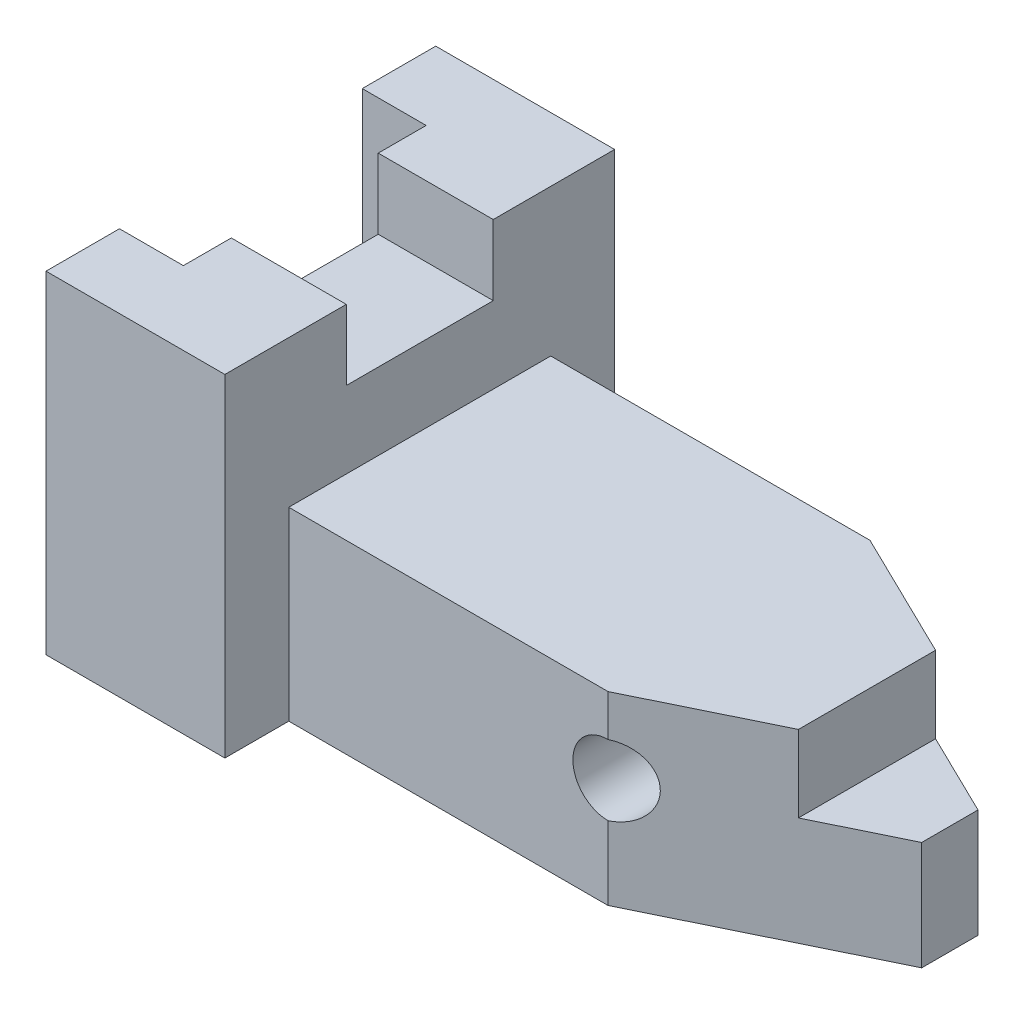
ISO-10303-21;
HEADER;
FILE_DESCRIPTION(('STEP AP214'),'2;1');
FILE_NAME('part.step','',(''),(''),'','','');
FILE_SCHEMA(('AUTOMOTIVE_DESIGN { 1 0 10303 214 1 1 1 1 }'));
ENDSEC;
DATA;
#1=APPLICATION_CONTEXT('core data for automotive mechanical design processes');
#2=APPLICATION_PROTOCOL_DEFINITION('international standard','automotive_design',2000,#1);
#3=PRODUCT_CONTEXT('',#1,'mechanical');
#4=PRODUCT('Part','Part','',(#3));
#5=PRODUCT_RELATED_PRODUCT_CATEGORY('part','',(#4));
#6=PRODUCT_DEFINITION_FORMATION('','',#4);
#7=PRODUCT_DEFINITION_CONTEXT('part definition',#1,'design');
#8=PRODUCT_DEFINITION('design','',#6,#7);
#9=PRODUCT_DEFINITION_SHAPE('','',#8);
#10=(LENGTH_UNIT() NAMED_UNIT(*) SI_UNIT(.MILLI.,.METRE.));
#11=(NAMED_UNIT(*) PLANE_ANGLE_UNIT() SI_UNIT($,.RADIAN.));
#12=(NAMED_UNIT(*) SI_UNIT($,.STERADIAN.) SOLID_ANGLE_UNIT());
#13=UNCERTAINTY_MEASURE_WITH_UNIT(LENGTH_MEASURE(1.E-05),#10,'distance_accuracy_value','');
#14=(GEOMETRIC_REPRESENTATION_CONTEXT(3) GLOBAL_UNCERTAINTY_ASSIGNED_CONTEXT((#13)) GLOBAL_UNIT_ASSIGNED_CONTEXT((#10,
#11,#12)) REPRESENTATION_CONTEXT('',''));
#15=CARTESIAN_POINT('',(0.,0.,0.));
#16=DIRECTION('',(0.,0.,1.));
#17=DIRECTION('',(1.,0.,0.));
#18=AXIS2_PLACEMENT_3D('',#15,#16,#17);
#19=CARTESIAN_POINT('',(0.,52.,11.5));
#20=DIRECTION('',(0.,0.,-1.));
#21=DIRECTION('',(-1.,0.,0.));
#22=AXIS2_PLACEMENT_3D('',#19,#20,#21);
#23=PLANE('',#22);
#24=DIRECTION('',(1.,0.,0.));
#25=VECTOR('',#24,1.);
#26=CARTESIAN_POINT('',(0.,41.,11.5));
#27=LINE('',#26,#25);
#28=CARTESIAN_POINT('',(10.,41.,11.5));
#29=VERTEX_POINT('',#28);
#30=CARTESIAN_POINT('',(28.,41.,11.5));
#31=VERTEX_POINT('',#30);
#32=EDGE_CURVE('E265',#29,#31,#27,.T.);
#33=ORIENTED_EDGE('',*,*,#32,.F.);
#34=DIRECTION('',(0.,-1.,0.));
#35=VECTOR('',#34,1.);
#36=CARTESIAN_POINT('',(10.,52.,11.5));
#37=LINE('',#36,#35);
#38=CARTESIAN_POINT('',(10.,52.,11.5));
#39=VERTEX_POINT('',#38);
#40=EDGE_CURVE('E46',#39,#29,#37,.T.);
#41=ORIENTED_EDGE('',*,*,#40,.F.);
#42=DIRECTION('',(1.,0.,0.));
#43=VECTOR('',#42,1.);
#44=CARTESIAN_POINT('',(0.,52.,11.5));
#45=LINE('',#44,#43);
#46=CARTESIAN_POINT('',(28.,52.,11.5));
#47=VERTEX_POINT('',#46);
#48=EDGE_CURVE('E275',#39,#47,#45,.T.);
#49=ORIENTED_EDGE('',*,*,#48,.T.);
#50=DIRECTION('',(0.,-1.,0.));
#51=VECTOR('',#50,1.);
#52=CARTESIAN_POINT('',(28.,52.,11.5));
#53=LINE('',#52,#51);
#54=EDGE_CURVE('E290',#47,#31,#53,.T.);
#55=ORIENTED_EDGE('',*,*,#54,.T.);
#56=EDGE_LOOP('',(#33,#41,#49,#55));
#57=FACE_BOUND('',#56,.T.);
#58=ADVANCED_FACE('F39',(#57),#23,.T.);
#59=CARTESIAN_POINT('',(10.,52.,0.));
#60=DIRECTION('',(1.,0.,0.));
#61=DIRECTION('',(0.,0.,-1.));
#62=AXIS2_PLACEMENT_3D('',#59,#60,#61);
#63=PLANE('',#62);
#64=DIRECTION('',(0.,0.,1.));
#65=VECTOR('',#64,1.);
#66=CARTESIAN_POINT('',(10.,0.,0.));
#67=LINE('',#66,#65);
#68=CARTESIAN_POINT('',(10.,0.,-19.));
#69=VERTEX_POINT('',#68);
#70=CARTESIAN_POINT('',(10.,0.,19.));
#71=VERTEX_POINT('',#70);
#72=EDGE_CURVE('E271',#69,#71,#67,.T.);
#73=ORIENTED_EDGE('',*,*,#72,.T.);
#74=DIRECTION('',(0.,-1.,0.));
#75=VECTOR('',#74,1.);
#76=CARTESIAN_POINT('',(10.,52.,19.));
#77=LINE('',#76,#75);
#78=CARTESIAN_POINT('',(10.,52.,19.));
#79=VERTEX_POINT('',#78);
#80=EDGE_CURVE('E310',#79,#71,#77,.T.);
#81=ORIENTED_EDGE('',*,*,#80,.F.);
#82=DIRECTION('',(0.,0.,1.));
#83=VECTOR('',#82,1.);
#84=CARTESIAN_POINT('',(10.,52.,0.));
#85=LINE('',#84,#83);
#86=EDGE_CURVE('E274',#39,#79,#85,.T.);
#87=ORIENTED_EDGE('',*,*,#86,.F.);
#88=ORIENTED_EDGE('',*,*,#40,.T.);
#89=DIRECTION('',(0.,0.,1.));
#90=VECTOR('',#89,1.);
#91=CARTESIAN_POINT('',(10.,41.,0.));
#92=LINE('',#91,#90);
#93=CARTESIAN_POINT('',(10.,41.,-11.5));
#94=VERTEX_POINT('',#93);
#95=EDGE_CURVE('E259',#94,#29,#92,.T.);
#96=ORIENTED_EDGE('',*,*,#95,.F.);
#97=DIRECTION('',(0.,-1.,0.));
#98=VECTOR('',#97,1.);
#99=CARTESIAN_POINT('',(10.,52.,-11.5));
#100=LINE('',#99,#98);
#101=CARTESIAN_POINT('',(10.,52.,-11.5));
#102=VERTEX_POINT('',#101);
#103=EDGE_CURVE('E258',#102,#94,#100,.T.);
#104=ORIENTED_EDGE('',*,*,#103,.F.);
#105=DIRECTION('',(0.,0.,1.));
#106=VECTOR('',#105,1.);
#107=CARTESIAN_POINT('',(10.,52.,0.));
#108=LINE('',#107,#106);
#109=CARTESIAN_POINT('',(10.,52.,-19.));
#110=VERTEX_POINT('',#109);
#111=EDGE_CURVE('E217',#110,#102,#108,.T.);
#112=ORIENTED_EDGE('',*,*,#111,.F.);
#113=DIRECTION('',(0.,-1.,0.));
#114=VECTOR('',#113,1.);
#115=CARTESIAN_POINT('',(10.,52.,-19.));
#116=LINE('',#115,#114);
#117=EDGE_CURVE('E237',#110,#69,#116,.T.);
#118=ORIENTED_EDGE('',*,*,#117,.T.);
#119=EDGE_LOOP('',(#73,#81,#87,#88,#96,#104,#112,#118));
#120=FACE_BOUND('',#119,.T.);
#121=ADVANCED_FACE('F314',(#120),#63,.F.);
#122=CARTESIAN_POINT('',(0.,52.,19.));
#123=DIRECTION('',(0.,0.,1.));
#124=DIRECTION('',(1.,0.,0.));
#125=AXIS2_PLACEMENT_3D('',#122,#123,#124);
#126=PLANE('',#125);
#127=DIRECTION('',(-1.,0.,0.));
#128=VECTOR('',#127,1.);
#129=CARTESIAN_POINT('',(0.,0.,19.));
#130=LINE('',#129,#128);
#131=CARTESIAN_POINT('',(0.,0.,19.));
#132=VERTEX_POINT('',#131);
#133=EDGE_CURVE('E289',#71,#132,#130,.T.);
#134=ORIENTED_EDGE('',*,*,#133,.T.);
#135=DIRECTION('',(0.,-1.,0.));
#136=VECTOR('',#135,1.);
#137=CARTESIAN_POINT('',(0.,52.,19.));
#138=LINE('',#137,#136);
#139=CARTESIAN_POINT('',(0.,52.,19.));
#140=VERTEX_POINT('',#139);
#141=EDGE_CURVE('E308',#140,#132,#138,.T.);
#142=ORIENTED_EDGE('',*,*,#141,.F.);
#143=DIRECTION('',(-1.,0.,0.));
#144=VECTOR('',#143,1.);
#145=CARTESIAN_POINT('',(0.,52.,19.));
#146=LINE('',#145,#144);
#147=EDGE_CURVE('E279',#79,#140,#146,.T.);
#148=ORIENTED_EDGE('',*,*,#147,.F.);
#149=ORIENTED_EDGE('',*,*,#80,.T.);
#150=EDGE_LOOP('',(#134,#142,#148,#149));
#151=FACE_BOUND('',#150,.T.);
#152=ADVANCED_FACE('F343',(#151),#126,.F.);
#153=CARTESIAN_POINT('',(0.,52.,0.));
#154=DIRECTION('',(1.,0.,0.));
#155=DIRECTION('',(0.,0.,-1.));
#156=AXIS2_PLACEMENT_3D('',#153,#154,#155);
#157=PLANE('',#156);
#158=DIRECTION('',(0.,0.,1.));
#159=VECTOR('',#158,1.);
#160=CARTESIAN_POINT('',(0.,0.,0.));
#161=LINE('',#160,#159);
#162=CARTESIAN_POINT('',(0.,0.,30.5));
#163=VERTEX_POINT('',#162);
#164=EDGE_CURVE('E292',#132,#163,#161,.T.);
#165=ORIENTED_EDGE('',*,*,#164,.T.);
#166=DIRECTION('',(0.,-1.,0.));
#167=VECTOR('',#166,1.);
#168=CARTESIAN_POINT('',(0.,52.,30.5));
#169=LINE('',#168,#167);
#170=CARTESIAN_POINT('',(0.,52.,30.5));
#171=VERTEX_POINT('',#170);
#172=EDGE_CURVE('E301',#171,#163,#169,.T.);
#173=ORIENTED_EDGE('',*,*,#172,.F.);
#174=DIRECTION('',(0.,0.,1.));
#175=VECTOR('',#174,1.);
#176=CARTESIAN_POINT('',(0.,52.,0.));
#177=LINE('',#176,#175);
#178=EDGE_CURVE('E278',#140,#171,#177,.T.);
#179=ORIENTED_EDGE('',*,*,#178,.F.);
#180=ORIENTED_EDGE('',*,*,#141,.T.);
#181=EDGE_LOOP('',(#165,#173,#179,#180));
#182=FACE_BOUND('',#181,.T.);
#183=ADVANCED_FACE('F372',(#182),#157,.F.);
#184=CARTESIAN_POINT('',(0.,52.,30.5));
#185=DIRECTION('',(0.,0.,-1.));
#186=DIRECTION('',(-1.,0.,0.));
#187=AXIS2_PLACEMENT_3D('',#184,#185,#186);
#188=PLANE('',#187);
#189=DIRECTION('',(1.,0.,0.));
#190=VECTOR('',#189,1.);
#191=CARTESIAN_POINT('',(0.,0.,30.5));
#192=LINE('',#191,#190);
#193=CARTESIAN_POINT('',(28.,0.,30.5));
#194=VERTEX_POINT('',#193);
#195=EDGE_CURVE('E291',#163,#194,#192,.T.);
#196=ORIENTED_EDGE('',*,*,#195,.T.);
#197=DIRECTION('',(0.,-1.,0.));
#198=VECTOR('',#197,1.);
#199=CARTESIAN_POINT('',(28.,52.,30.5));
#200=LINE('',#199,#198);
#201=CARTESIAN_POINT('',(28.,52.,30.5));
#202=VERTEX_POINT('',#201);
#203=EDGE_CURVE('E298',#202,#194,#200,.T.);
#204=ORIENTED_EDGE('',*,*,#203,.F.);
#205=DIRECTION('',(1.,0.,0.));
#206=VECTOR('',#205,1.);
#207=CARTESIAN_POINT('',(0.,52.,30.5));
#208=LINE('',#207,#206);
#209=EDGE_CURVE('E285',#171,#202,#208,.T.);
#210=ORIENTED_EDGE('',*,*,#209,.F.);
#211=ORIENTED_EDGE('',*,*,#172,.T.);
#212=EDGE_LOOP('',(#196,#204,#210,#211));
#213=FACE_BOUND('',#212,.T.);
#214=ADVANCED_FACE('F377',(#213),#188,.F.);
#215=CARTESIAN_POINT('',(28.,52.,0.));
#216=DIRECTION('',(1.,0.,0.));
#217=DIRECTION('',(0.,0.,-1.));
#218=AXIS2_PLACEMENT_3D('',#215,#216,#217);
#219=PLANE('',#218);
#220=DIRECTION('',(0.,-1.,0.));
#221=VECTOR('',#220,1.);
#222=CARTESIAN_POINT('',(28.,29.,20.5));
#223=LINE('',#222,#221);
#224=CARTESIAN_POINT('',(28.,29.,20.5));
#225=VERTEX_POINT('',#224);
#226=CARTESIAN_POINT('',(28.,0.,20.5));
#227=VERTEX_POINT('',#226);
#228=EDGE_CURVE('E212',#225,#227,#223,.T.);
#229=ORIENTED_EDGE('',*,*,#228,.F.);
#230=DIRECTION('',(0.,0.,1.));
#231=VECTOR('',#230,1.);
#232=CARTESIAN_POINT('',(28.,29.,0.));
#233=LINE('',#232,#231);
#234=CARTESIAN_POINT('',(28.,29.,-20.5));
#235=VERTEX_POINT('',#234);
#236=EDGE_CURVE('E614',#235,#225,#233,.T.);
#237=ORIENTED_EDGE('',*,*,#236,.F.);
#238=DIRECTION('',(0.,-1.,0.));
#239=VECTOR('',#238,1.);
#240=CARTESIAN_POINT('',(28.,29.,-20.5));
#241=LINE('',#240,#239);
#242=CARTESIAN_POINT('',(28.,0.,-20.5));
#243=VERTEX_POINT('',#242);
#244=EDGE_CURVE('E202',#235,#243,#241,.T.);
#245=ORIENTED_EDGE('',*,*,#244,.T.);
#246=DIRECTION('',(0.,0.,1.));
#247=VECTOR('',#246,1.);
#248=CARTESIAN_POINT('',(28.,0.,0.));
#249=LINE('',#248,#247);
#250=CARTESIAN_POINT('',(28.,0.,-30.5));
#251=VERTEX_POINT('',#250);
#252=EDGE_CURVE('E277',#251,#243,#249,.T.);
#253=ORIENTED_EDGE('',*,*,#252,.F.);
#254=DIRECTION('',(0.,-1.,0.));
#255=VECTOR('',#254,1.);
#256=CARTESIAN_POINT('',(28.,52.,-30.5));
#257=LINE('',#256,#255);
#258=CARTESIAN_POINT('',(28.,52.,-30.5));
#259=VERTEX_POINT('',#258);
#260=EDGE_CURVE('E247',#259,#251,#257,.T.);
#261=ORIENTED_EDGE('',*,*,#260,.F.);
#262=DIRECTION('',(0.,0.,1.));
#263=VECTOR('',#262,1.);
#264=CARTESIAN_POINT('',(28.,52.,0.));
#265=LINE('',#264,#263);
#266=CARTESIAN_POINT('',(28.,52.,-11.5));
#267=VERTEX_POINT('',#266);
#268=EDGE_CURVE('E221',#259,#267,#265,.T.);
#269=ORIENTED_EDGE('',*,*,#268,.T.);
#270=DIRECTION('',(0.,-1.,0.));
#271=VECTOR('',#270,1.);
#272=CARTESIAN_POINT('',(28.,52.,-11.5));
#273=LINE('',#272,#271);
#274=CARTESIAN_POINT('',(28.,41.,-11.5));
#275=VERTEX_POINT('',#274);
#276=EDGE_CURVE('E251',#267,#275,#273,.T.);
#277=ORIENTED_EDGE('',*,*,#276,.T.);
#278=DIRECTION('',(0.,0.,1.));
#279=VECTOR('',#278,1.);
#280=CARTESIAN_POINT('',(28.,41.,0.));
#281=LINE('',#280,#279);
#282=EDGE_CURVE('E264',#275,#31,#281,.T.);
#283=ORIENTED_EDGE('',*,*,#282,.T.);
#284=ORIENTED_EDGE('',*,*,#54,.F.);
#285=DIRECTION('',(0.,0.,1.));
#286=VECTOR('',#285,1.);
#287=CARTESIAN_POINT('',(28.,52.,0.));
#288=LINE('',#287,#286);
#289=EDGE_CURVE('E281',#47,#202,#288,.T.);
#290=ORIENTED_EDGE('',*,*,#289,.T.);
#291=ORIENTED_EDGE('',*,*,#203,.T.);
#292=EDGE_CURVE('E297',#227,#194,#249,.T.);
#293=ORIENTED_EDGE('',*,*,#292,.F.);
#294=EDGE_LOOP('',(#229,#237,#245,#253,#261,#269,#277,#283,#284,#290,#291,#293));
#295=FACE_BOUND('',#294,.T.);
#296=ADVANCED_FACE('F348',(#295),#219,.T.);
#297=CARTESIAN_POINT('',(0.,52.,0.));
#298=DIRECTION('',(0.,1.,0.));
#299=DIRECTION('',(0.,0.,1.));
#300=AXIS2_PLACEMENT_3D('',#297,#298,#299);
#301=PLANE('',#300);
#302=ORIENTED_EDGE('',*,*,#48,.F.);
#303=ORIENTED_EDGE('',*,*,#86,.T.);
#304=ORIENTED_EDGE('',*,*,#147,.T.);
#305=ORIENTED_EDGE('',*,*,#178,.T.);
#306=ORIENTED_EDGE('',*,*,#209,.T.);
#307=ORIENTED_EDGE('',*,*,#289,.F.);
#308=EDGE_LOOP('',(#302,#303,#304,#305,#306,#307));
#309=FACE_BOUND('',#308,.T.);
#310=ADVANCED_FACE('F342',(#309),#301,.T.);
#311=CARTESIAN_POINT('',(0.,0.,0.));
#312=DIRECTION('',(0.,1.,0.));
#313=DIRECTION('',(0.,0.,1.));
#314=AXIS2_PLACEMENT_3D('',#311,#312,#313);
#315=PLANE('',#314);
#316=ORIENTED_EDGE('',*,*,#72,.F.);
#317=DIRECTION('',(-1.,0.,0.));
#318=VECTOR('',#317,1.);
#319=CARTESIAN_POINT('',(0.,0.,-19.));
#320=LINE('',#319,#318);
#321=CARTESIAN_POINT('',(0.,0.,-19.));
#322=VERTEX_POINT('',#321);
#323=EDGE_CURVE('E225',#69,#322,#320,.T.);
#324=ORIENTED_EDGE('',*,*,#323,.T.);
#325=DIRECTION('',(0.,0.,-1.));
#326=VECTOR('',#325,1.);
#327=CARTESIAN_POINT('',(0.,0.,0.));
#328=LINE('',#327,#326);
#329=CARTESIAN_POINT('',(0.,0.,-30.5));
#330=VERTEX_POINT('',#329);
#331=EDGE_CURVE('E239',#322,#330,#328,.T.);
#332=ORIENTED_EDGE('',*,*,#331,.T.);
#333=DIRECTION('',(1.,0.,0.));
#334=VECTOR('',#333,1.);
#335=CARTESIAN_POINT('',(0.,0.,-30.5));
#336=LINE('',#335,#334);
#337=EDGE_CURVE('E220',#330,#251,#336,.T.);
#338=ORIENTED_EDGE('',*,*,#337,.T.);
#339=ORIENTED_EDGE('',*,*,#252,.T.);
#340=DIRECTION('',(1.,0.,0.));
#341=VECTOR('',#340,1.);
#342=CARTESIAN_POINT('',(0.,0.,-20.5));
#343=LINE('',#342,#341);
#344=CARTESIAN_POINT('',(77.9687712476245,0.,-20.5));
#345=VERTEX_POINT('',#344);
#346=EDGE_CURVE('E620',#243,#345,#343,.T.);
#347=ORIENTED_EDGE('',*,*,#346,.T.);
#348=DIRECTION('',(0.898794046299167,0.,0.438371146789078));
#349=VECTOR('',#348,1.);
#350=CARTESIAN_POINT('',(23.0603114804606,0.,-47.2806452164034));
#351=LINE('',#350,#349);
#352=CARTESIAN_POINT('',(110.968771247625,0.,-4.40482457732654));
#353=VERTEX_POINT('',#352);
#354=EDGE_CURVE('E633',#345,#353,#351,.T.);
#355=ORIENTED_EDGE('',*,*,#354,.T.);
#356=DIRECTION('',(0.,0.,1.));
#357=VECTOR('',#356,1.);
#358=CARTESIAN_POINT('',(110.968771247625,0.,0.));
#359=LINE('',#358,#357);
#360=CARTESIAN_POINT('',(110.968771247625,0.,4.40482457732653));
#361=VERTEX_POINT('',#360);
#362=EDGE_CURVE('E592',#353,#361,#359,.T.);
#363=ORIENTED_EDGE('',*,*,#362,.T.);
#364=DIRECTION('',(0.898794046299167,0.,-0.438371146789078));
#365=VECTOR('',#364,1.);
#366=CARTESIAN_POINT('',(23.0603114804606,0.,47.2806452164034));
#367=LINE('',#366,#365);
#368=CARTESIAN_POINT('',(77.9687712476245,0.,20.5));
#369=VERTEX_POINT('',#368);
#370=EDGE_CURVE('E626',#369,#361,#367,.T.);
#371=ORIENTED_EDGE('',*,*,#370,.F.);
#372=DIRECTION('',(1.,0.,0.));
#373=VECTOR('',#372,1.);
#374=CARTESIAN_POINT('',(0.,0.,20.5));
#375=LINE('',#374,#373);
#376=EDGE_CURVE('E615',#227,#369,#375,.T.);
#377=ORIENTED_EDGE('',*,*,#376,.F.);
#378=ORIENTED_EDGE('',*,*,#292,.T.);
#379=ORIENTED_EDGE('',*,*,#195,.F.);
#380=ORIENTED_EDGE('',*,*,#164,.F.);
#381=ORIENTED_EDGE('',*,*,#133,.F.);
#382=EDGE_LOOP('',(#316,#324,#332,#338,#339,#347,#355,#363,#371,#377,#378,#379,#380,#381));
#383=FACE_BOUND('',#382,.T.);
#384=ADVANCED_FACE('F337',(#383),#315,.F.);
#385=CARTESIAN_POINT('',(0.,41.,0.));
#386=DIRECTION('',(0.,1.,0.));
#387=DIRECTION('',(0.,0.,1.));
#388=AXIS2_PLACEMENT_3D('',#385,#386,#387);
#389=PLANE('',#388);
#390=ORIENTED_EDGE('',*,*,#95,.T.);
#391=ORIENTED_EDGE('',*,*,#32,.T.);
#392=ORIENTED_EDGE('',*,*,#282,.F.);
#393=DIRECTION('',(1.,0.,0.));
#394=VECTOR('',#393,1.);
#395=CARTESIAN_POINT('',(0.,41.,-11.5));
#396=LINE('',#395,#394);
#397=EDGE_CURVE('E268',#94,#275,#396,.T.);
#398=ORIENTED_EDGE('',*,*,#397,.F.);
#399=EDGE_LOOP('',(#390,#391,#392,#398));
#400=FACE_BOUND('',#399,.T.);
#401=ADVANCED_FACE('F321',(#400),#389,.T.);
#402=CARTESIAN_POINT('',(0.,52.,-11.5));
#403=DIRECTION('',(0.,0.,-1.));
#404=DIRECTION('',(-1.,0.,0.));
#405=AXIS2_PLACEMENT_3D('',#402,#403,#404);
#406=PLANE('',#405);
#407=ORIENTED_EDGE('',*,*,#103,.T.);
#408=ORIENTED_EDGE('',*,*,#397,.T.);
#409=ORIENTED_EDGE('',*,*,#276,.F.);
#410=DIRECTION('',(1.,0.,0.));
#411=VECTOR('',#410,1.);
#412=CARTESIAN_POINT('',(0.,52.,-11.5));
#413=LINE('',#412,#411);
#414=EDGE_CURVE('E222',#102,#267,#413,.T.);
#415=ORIENTED_EDGE('',*,*,#414,.F.);
#416=EDGE_LOOP('',(#407,#408,#409,#415));
#417=FACE_BOUND('',#416,.T.);
#418=ADVANCED_FACE('F322',(#417),#406,.F.);
#419=CARTESIAN_POINT('',(0.,52.,-30.5));
#420=DIRECTION('',(0.,0.,-1.));
#421=DIRECTION('',(-1.,0.,0.));
#422=AXIS2_PLACEMENT_3D('',#419,#420,#421);
#423=PLANE('',#422);
#424=ORIENTED_EDGE('',*,*,#337,.F.);
#425=DIRECTION('',(0.,-1.,0.));
#426=VECTOR('',#425,1.);
#427=CARTESIAN_POINT('',(0.,52.,-30.5));
#428=LINE('',#427,#426);
#429=CARTESIAN_POINT('',(0.,52.,-30.5));
#430=VERTEX_POINT('',#429);
#431=EDGE_CURVE('E246',#430,#330,#428,.T.);
#432=ORIENTED_EDGE('',*,*,#431,.F.);
#433=DIRECTION('',(1.,0.,0.));
#434=VECTOR('',#433,1.);
#435=CARTESIAN_POINT('',(0.,52.,-30.5));
#436=LINE('',#435,#434);
#437=EDGE_CURVE('E230',#430,#259,#436,.T.);
#438=ORIENTED_EDGE('',*,*,#437,.T.);
#439=ORIENTED_EDGE('',*,*,#260,.T.);
#440=EDGE_LOOP('',(#424,#432,#438,#439));
#441=FACE_BOUND('',#440,.T.);
#442=ADVANCED_FACE('F351',(#441),#423,.T.);
#443=CARTESIAN_POINT('',(0.,52.,0.));
#444=DIRECTION('',(-1.,0.,0.));
#445=DIRECTION('',(0.,0.,1.));
#446=AXIS2_PLACEMENT_3D('',#443,#444,#445);
#447=PLANE('',#446);
#448=ORIENTED_EDGE('',*,*,#331,.F.);
#449=DIRECTION('',(0.,-1.,0.));
#450=VECTOR('',#449,1.);
#451=CARTESIAN_POINT('',(0.,52.,-19.));
#452=LINE('',#451,#450);
#453=CARTESIAN_POINT('',(0.,52.,-19.));
#454=VERTEX_POINT('',#453);
#455=EDGE_CURVE('E248',#454,#322,#452,.T.);
#456=ORIENTED_EDGE('',*,*,#455,.F.);
#457=DIRECTION('',(0.,0.,-1.));
#458=VECTOR('',#457,1.);
#459=CARTESIAN_POINT('',(0.,52.,0.));
#460=LINE('',#459,#458);
#461=EDGE_CURVE('E228',#454,#430,#460,.T.);
#462=ORIENTED_EDGE('',*,*,#461,.T.);
#463=ORIENTED_EDGE('',*,*,#431,.T.);
#464=EDGE_LOOP('',(#448,#456,#462,#463));
#465=FACE_BOUND('',#464,.T.);
#466=ADVANCED_FACE('F358',(#465),#447,.T.);
#467=CARTESIAN_POINT('',(0.,52.,-19.));
#468=DIRECTION('',(0.,0.,1.));
#469=DIRECTION('',(1.,0.,0.));
#470=AXIS2_PLACEMENT_3D('',#467,#468,#469);
#471=PLANE('',#470);
#472=ORIENTED_EDGE('',*,*,#323,.F.);
#473=ORIENTED_EDGE('',*,*,#117,.F.);
#474=DIRECTION('',(-1.,0.,0.));
#475=VECTOR('',#474,1.);
#476=CARTESIAN_POINT('',(0.,52.,-19.));
#477=LINE('',#476,#475);
#478=EDGE_CURVE('E231',#110,#454,#477,.T.);
#479=ORIENTED_EDGE('',*,*,#478,.T.);
#480=ORIENTED_EDGE('',*,*,#455,.T.);
#481=EDGE_LOOP('',(#472,#473,#479,#480));
#482=FACE_BOUND('',#481,.T.);
#483=ADVANCED_FACE('F334',(#482),#471,.T.);
#484=CARTESIAN_POINT('',(0.,52.,0.));
#485=DIRECTION('',(0.,1.,0.));
#486=DIRECTION('',(0.,0.,1.));
#487=AXIS2_PLACEMENT_3D('',#484,#485,#486);
#488=PLANE('',#487);
#489=ORIENTED_EDGE('',*,*,#111,.T.);
#490=ORIENTED_EDGE('',*,*,#414,.T.);
#491=ORIENTED_EDGE('',*,*,#268,.F.);
#492=ORIENTED_EDGE('',*,*,#437,.F.);
#493=ORIENTED_EDGE('',*,*,#461,.F.);
#494=ORIENTED_EDGE('',*,*,#478,.F.);
#495=EDGE_LOOP('',(#489,#490,#491,#492,#493,#494));
#496=FACE_BOUND('',#495,.T.);
#497=ADVANCED_FACE('F329',(#496),#488,.T.);
#498=CARTESIAN_POINT('',(0.,29.,20.5));
#499=DIRECTION('',(0.,0.,-1.));
#500=DIRECTION('',(-1.,0.,0.));
#501=AXIS2_PLACEMENT_3D('',#498,#499,#500);
#502=PLANE('',#501);
#503=DIRECTION('',(0.,-1.,0.));
#504=VECTOR('',#503,1.);
#505=CARTESIAN_POINT('',(77.9687712476245,29.,20.5));
#506=LINE('',#505,#504);
#507=CARTESIAN_POINT('',(77.9687712476245,11.5,20.5));
#508=VERTEX_POINT('',#507);
#509=EDGE_CURVE('E209',#508,#369,#506,.T.);
#510=ORIENTED_EDGE('',*,*,#509,.F.);
#511=CARTESIAN_POINT('',(77.9687712476245,17.,20.5));
#512=DIRECTION('',(0.,0.,-1.));
#513=DIRECTION('',(-1.,0.,0.));
#514=AXIS2_PLACEMENT_3D('',#511,#512,#513);
#515=CIRCLE('',#514,5.5);
#516=CARTESIAN_POINT('',(77.9687712476245,22.5,20.5));
#517=VERTEX_POINT('',#516);
#518=EDGE_CURVE('E55',#508,#517,#515,.T.);
#519=ORIENTED_EDGE('',*,*,#518,.T.);
#520=CARTESIAN_POINT('',(77.9687712476245,29.,20.5));
#521=VERTEX_POINT('',#520);
#522=EDGE_CURVE('E211',#521,#517,#506,.T.);
#523=ORIENTED_EDGE('',*,*,#522,.F.);
#524=DIRECTION('',(1.,0.,0.));
#525=VECTOR('',#524,1.);
#526=CARTESIAN_POINT('',(0.,29.,20.5));
#527=LINE('',#526,#525);
#528=EDGE_CURVE('E618',#225,#521,#527,.T.);
#529=ORIENTED_EDGE('',*,*,#528,.F.);
#530=ORIENTED_EDGE('',*,*,#228,.T.);
#531=ORIENTED_EDGE('',*,*,#376,.T.);
#532=EDGE_LOOP('',(#510,#519,#523,#529,#530,#531));
#533=FACE_BOUND('',#532,.T.);
#534=ADVANCED_FACE('F425',(#533),#502,.F.);
#535=CARTESIAN_POINT('',(23.0603114804606,29.,47.2806452164034));
#536=DIRECTION('',(-0.438371146789078,0.,-0.898794046299167));
#537=DIRECTION('',(-0.898794046299166,0.,0.438371146789078));
#538=AXIS2_PLACEMENT_3D('',#535,#536,#537);
#539=PLANE('',#538);
#540=ORIENTED_EDGE('',*,*,#522,.T.);
#541=CARTESIAN_POINT('',(77.9687712476245,17.,20.5));
#542=DIRECTION('',(-0.438371146789078,0.,-0.898794046299167));
#543=DIRECTION('',(-0.898794046299167,0.,0.438371146789078));
#544=AXIS2_PLACEMENT_3D('',#541,#542,#543);
#545=ELLIPSE('',#544,6.11931067261354,5.5);
#546=EDGE_CURVE('E194',#517,#508,#545,.T.);
#547=ORIENTED_EDGE('',*,*,#546,.T.);
#548=ORIENTED_EDGE('',*,*,#509,.T.);
#549=ORIENTED_EDGE('',*,*,#370,.T.);
#550=DIRECTION('',(0.,-1.,0.));
#551=VECTOR('',#550,1.);
#552=CARTESIAN_POINT('',(110.968771247625,17.,4.40482457732653));
#553=LINE('',#552,#551);
#554=CARTESIAN_POINT('',(110.968771247625,17.,4.40482457732653));
#555=VERTEX_POINT('',#554);
#556=EDGE_CURVE('E606',#555,#361,#553,.T.);
#557=ORIENTED_EDGE('',*,*,#556,.F.);
#558=DIRECTION('',(0.898794046299167,0.,-0.438371146789078));
#559=VECTOR('',#558,1.);
#560=CARTESIAN_POINT('',(23.0603114804606,17.,47.2806452164034));
#561=LINE('',#560,#559);
#562=CARTESIAN_POINT('',(98.,17.,10.730116948449));
#563=VERTEX_POINT('',#562);
#564=EDGE_CURVE('E587',#563,#555,#561,.T.);
#565=ORIENTED_EDGE('',*,*,#564,.F.);
#566=DIRECTION('',(0.,-1.,0.));
#567=VECTOR('',#566,1.);
#568=CARTESIAN_POINT('',(98.,29.,10.730116948449));
#569=LINE('',#568,#567);
#570=CARTESIAN_POINT('',(98.,29.,10.730116948449));
#571=VERTEX_POINT('',#570);
#572=EDGE_CURVE('E201',#571,#563,#569,.T.);
#573=ORIENTED_EDGE('',*,*,#572,.F.);
#574=DIRECTION('',(0.898794046299167,0.,-0.438371146789078));
#575=VECTOR('',#574,1.);
#576=CARTESIAN_POINT('',(23.0603114804606,29.,47.2806452164034));
#577=LINE('',#576,#575);
#578=EDGE_CURVE('E619',#521,#571,#577,.T.);
#579=ORIENTED_EDGE('',*,*,#578,.F.);
#580=EDGE_LOOP('',(#540,#547,#548,#549,#557,#565,#573,#579));
#581=FACE_BOUND('',#580,.T.);
#582=ADVANCED_FACE('F437',(#581),#539,.F.);
#583=CARTESIAN_POINT('',(98.,29.,0.));
#584=DIRECTION('',(1.,0.,0.));
#585=DIRECTION('',(0.,0.,-1.));
#586=AXIS2_PLACEMENT_3D('',#583,#584,#585);
#587=PLANE('',#586);
#588=DIRECTION('',(0.,0.,1.));
#589=VECTOR('',#588,1.);
#590=CARTESIAN_POINT('',(98.,17.,0.));
#591=LINE('',#590,#589);
#592=CARTESIAN_POINT('',(98.,17.,-10.730116948449));
#593=VERTEX_POINT('',#592);
#594=EDGE_CURVE('E590',#593,#563,#591,.T.);
#595=ORIENTED_EDGE('',*,*,#594,.F.);
#596=DIRECTION('',(0.,-1.,0.));
#597=VECTOR('',#596,1.);
#598=CARTESIAN_POINT('',(98.,29.,-10.730116948449));
#599=LINE('',#598,#597);
#600=CARTESIAN_POINT('',(98.,29.,-10.730116948449));
#601=VERTEX_POINT('',#600);
#602=EDGE_CURVE('E199',#601,#593,#599,.T.);
#603=ORIENTED_EDGE('',*,*,#602,.F.);
#604=DIRECTION('',(0.,0.,1.));
#605=VECTOR('',#604,1.);
#606=CARTESIAN_POINT('',(98.,29.,0.));
#607=LINE('',#606,#605);
#608=EDGE_CURVE('E622',#601,#571,#607,.T.);
#609=ORIENTED_EDGE('',*,*,#608,.T.);
#610=ORIENTED_EDGE('',*,*,#572,.T.);
#611=EDGE_LOOP('',(#595,#603,#609,#610));
#612=FACE_BOUND('',#611,.T.);
#613=ADVANCED_FACE('F450',(#612),#587,.T.);
#614=CARTESIAN_POINT('',(23.0603114804606,29.,-47.2806452164034));
#615=DIRECTION('',(0.438371146789078,0.,-0.898794046299167));
#616=DIRECTION('',(-0.898794046299166,0.,-0.438371146789078));
#617=AXIS2_PLACEMENT_3D('',#614,#615,#616);
#618=PLANE('',#617);
#619=CARTESIAN_POINT('',(77.9687712476245,17.,-20.5));
#620=DIRECTION('',(0.438371146789078,0.,-0.898794046299167));
#621=DIRECTION('',(0.898794046299167,0.,0.438371146789078));
#622=AXIS2_PLACEMENT_3D('',#619,#620,#621);
#623=ELLIPSE('',#622,6.11931067261354,5.5);
#624=CARTESIAN_POINT('',(77.9687712476245,22.5,-20.5));
#625=VERTEX_POINT('',#624);
#626=CARTESIAN_POINT('',(77.9687712476245,11.5,-20.5));
#627=VERTEX_POINT('',#626);
#628=EDGE_CURVE('E59',#625,#627,#623,.T.);
#629=ORIENTED_EDGE('',*,*,#628,.F.);
#630=DIRECTION('',(0.,-1.,0.));
#631=VECTOR('',#630,1.);
#632=CARTESIAN_POINT('',(77.9687712476245,29.,-20.5));
#633=LINE('',#632,#631);
#634=CARTESIAN_POINT('',(77.9687712476245,29.,-20.5));
#635=VERTEX_POINT('',#634);
#636=EDGE_CURVE('E188',#635,#625,#633,.T.);
#637=ORIENTED_EDGE('',*,*,#636,.F.);
#638=DIRECTION('',(0.898794046299167,0.,0.438371146789078));
#639=VECTOR('',#638,1.);
#640=CARTESIAN_POINT('',(23.0603114804606,29.,-47.2806452164034));
#641=LINE('',#640,#639);
#642=EDGE_CURVE('E624',#635,#601,#641,.T.);
#643=ORIENTED_EDGE('',*,*,#642,.T.);
#644=ORIENTED_EDGE('',*,*,#602,.T.);
#645=DIRECTION('',(0.898794046299167,0.,0.438371146789078));
#646=VECTOR('',#645,1.);
#647=CARTESIAN_POINT('',(23.0603114804606,17.,-47.2806452164034));
#648=LINE('',#647,#646);
#649=CARTESIAN_POINT('',(110.968771247625,17.,-4.40482457732654));
#650=VERTEX_POINT('',#649);
#651=EDGE_CURVE('E593',#593,#650,#648,.T.);
#652=ORIENTED_EDGE('',*,*,#651,.T.);
#653=DIRECTION('',(0.,-1.,0.));
#654=VECTOR('',#653,1.);
#655=CARTESIAN_POINT('',(110.968771247625,17.,-4.40482457732654));
#656=LINE('',#655,#654);
#657=EDGE_CURVE('E604',#650,#353,#656,.T.);
#658=ORIENTED_EDGE('',*,*,#657,.T.);
#659=ORIENTED_EDGE('',*,*,#354,.F.);
#660=EDGE_CURVE('E191',#627,#345,#633,.T.);
#661=ORIENTED_EDGE('',*,*,#660,.F.);
#662=EDGE_LOOP('',(#629,#637,#643,#644,#652,#658,#659,#661));
#663=FACE_BOUND('',#662,.T.);
#664=ADVANCED_FACE('F189',(#663),#618,.T.);
#665=CARTESIAN_POINT('',(0.,29.,-20.5));
#666=DIRECTION('',(0.,0.,-1.));
#667=DIRECTION('',(-1.,0.,0.));
#668=AXIS2_PLACEMENT_3D('',#665,#666,#667);
#669=PLANE('',#668);
#670=CARTESIAN_POINT('',(77.9687712476245,17.,-20.5));
#671=DIRECTION('',(0.,0.,-1.));
#672=DIRECTION('',(-1.,0.,0.));
#673=AXIS2_PLACEMENT_3D('',#670,#671,#672);
#674=CIRCLE('',#673,5.5);
#675=EDGE_CURVE('E11',#627,#625,#674,.T.);
#676=ORIENTED_EDGE('',*,*,#675,.F.);
#677=ORIENTED_EDGE('',*,*,#660,.T.);
#678=ORIENTED_EDGE('',*,*,#346,.F.);
#679=ORIENTED_EDGE('',*,*,#244,.F.);
#680=DIRECTION('',(1.,0.,0.));
#681=VECTOR('',#680,1.);
#682=CARTESIAN_POINT('',(0.,29.,-20.5));
#683=LINE('',#682,#681);
#684=EDGE_CURVE('E200',#235,#635,#683,.T.);
#685=ORIENTED_EDGE('',*,*,#684,.T.);
#686=ORIENTED_EDGE('',*,*,#636,.T.);
#687=EDGE_LOOP('',(#676,#677,#678,#679,#685,#686));
#688=FACE_BOUND('',#687,.T.);
#689=ADVANCED_FACE('F197',(#688),#669,.T.);
#690=CARTESIAN_POINT('',(0.,29.,0.));
#691=DIRECTION('',(0.,1.,0.));
#692=DIRECTION('',(0.,0.,1.));
#693=AXIS2_PLACEMENT_3D('',#690,#691,#692);
#694=PLANE('',#693);
#695=ORIENTED_EDGE('',*,*,#236,.T.);
#696=ORIENTED_EDGE('',*,*,#528,.T.);
#697=ORIENTED_EDGE('',*,*,#578,.T.);
#698=ORIENTED_EDGE('',*,*,#608,.F.);
#699=ORIENTED_EDGE('',*,*,#642,.F.);
#700=ORIENTED_EDGE('',*,*,#684,.F.);
#701=EDGE_LOOP('',(#695,#696,#697,#698,#699,#700));
#702=FACE_BOUND('',#701,.T.);
#703=ADVANCED_FACE('F471',(#702),#694,.T.);
#704=CARTESIAN_POINT('',(110.968771247625,17.,0.));
#705=DIRECTION('',(1.,0.,0.));
#706=DIRECTION('',(0.,0.,-1.));
#707=AXIS2_PLACEMENT_3D('',#704,#705,#706);
#708=PLANE('',#707);
#709=ORIENTED_EDGE('',*,*,#362,.F.);
#710=ORIENTED_EDGE('',*,*,#657,.F.);
#711=DIRECTION('',(0.,0.,1.));
#712=VECTOR('',#711,1.);
#713=CARTESIAN_POINT('',(110.968771247625,17.,0.));
#714=LINE('',#713,#712);
#715=EDGE_CURVE('E596',#650,#555,#714,.T.);
#716=ORIENTED_EDGE('',*,*,#715,.T.);
#717=ORIENTED_EDGE('',*,*,#556,.T.);
#718=EDGE_LOOP('',(#709,#710,#716,#717));
#719=FACE_BOUND('',#718,.T.);
#720=ADVANCED_FACE('F481',(#719),#708,.T.);
#721=CARTESIAN_POINT('',(0.,17.,0.));
#722=DIRECTION('',(0.,1.,0.));
#723=DIRECTION('',(0.,0.,1.));
#724=AXIS2_PLACEMENT_3D('',#721,#722,#723);
#725=PLANE('',#724);
#726=ORIENTED_EDGE('',*,*,#594,.T.);
#727=ORIENTED_EDGE('',*,*,#564,.T.);
#728=ORIENTED_EDGE('',*,*,#715,.F.);
#729=ORIENTED_EDGE('',*,*,#651,.F.);
#730=EDGE_LOOP('',(#726,#727,#728,#729));
#731=FACE_BOUND('',#730,.T.);
#732=ADVANCED_FACE('F491',(#731),#725,.T.);
#733=CARTESIAN_POINT('',(77.9687712476245,17.,-30.5));
#734=DIRECTION('',(0.,0.,1.));
#735=DIRECTION('',(1.,0.,0.));
#736=AXIS2_PLACEMENT_3D('',#733,#734,#735);
#737=CYLINDRICAL_SURFACE('',#736,5.5);
#738=ORIENTED_EDGE('',*,*,#628,.T.);
#739=ORIENTED_EDGE('',*,*,#675,.T.);
#740=EDGE_LOOP('',(#738,#739));
#741=FACE_BOUND('',#740,.T.);
#742=ORIENTED_EDGE('',*,*,#546,.F.);
#743=ORIENTED_EDGE('',*,*,#518,.F.);
#744=EDGE_LOOP('',(#742,#743));
#745=FACE_BOUND('',#744,.T.);
#746=ADVANCED_FACE('F181',(#741,#745),#737,.F.);
#747=CLOSED_SHELL('',(#58,#121,#152,#183,#214,#296,#310,#384,#401,#418,#442,#466,#483,#497,#534,
#582,#613,#664,#689,#703,#720,#732,#746));
#748=MANIFOLD_SOLID_BREP('B2',#747);
#749=ADVANCED_BREP_SHAPE_REPRESENTATION('',(#18,#748),#14);
#750=SHAPE_DEFINITION_REPRESENTATION(#9,#749);
ENDSEC;
END-ISO-10303-21;
